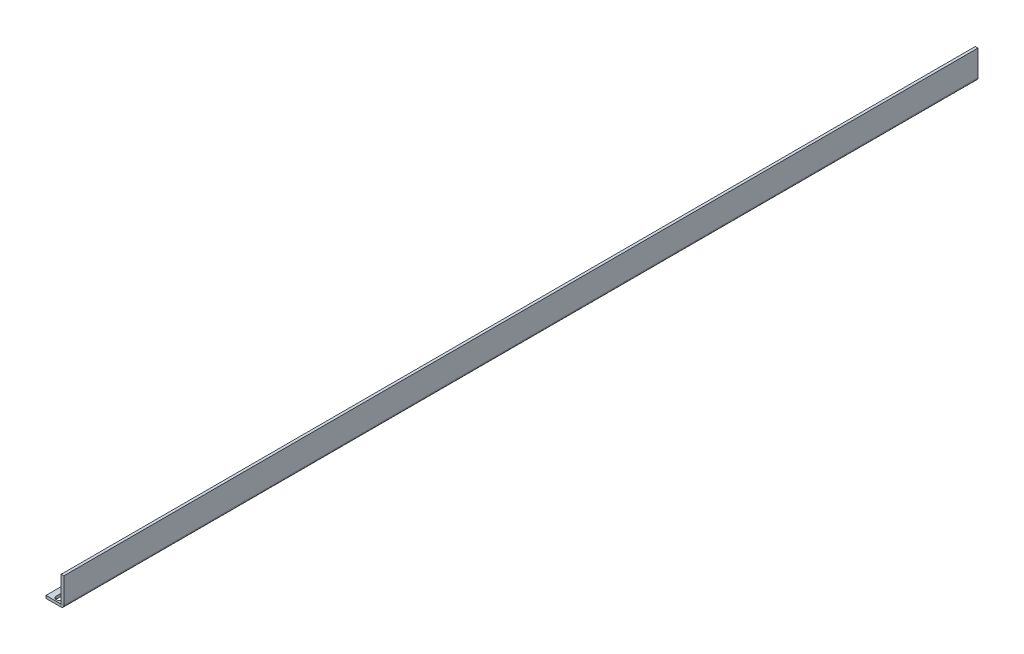
ISO-10303-21;
HEADER;
FILE_DESCRIPTION(('STEP AP214'),'2;1');
FILE_NAME('part.step','',(''),(''),'','','');
FILE_SCHEMA(('AUTOMOTIVE_DESIGN { 1 0 10303 214 1 1 1 1 }'));
ENDSEC;
DATA;
#1=APPLICATION_CONTEXT('core data for automotive mechanical design processes');
#2=APPLICATION_PROTOCOL_DEFINITION('international standard','automotive_design',2000,#1);
#3=PRODUCT_CONTEXT('',#1,'mechanical');
#4=PRODUCT('Part','Part','',(#3));
#5=PRODUCT_RELATED_PRODUCT_CATEGORY('part','',(#4));
#6=PRODUCT_DEFINITION_FORMATION('','',#4);
#7=PRODUCT_DEFINITION_CONTEXT('part definition',#1,'design');
#8=PRODUCT_DEFINITION('design','',#6,#7);
#9=PRODUCT_DEFINITION_SHAPE('','',#8);
#10=(LENGTH_UNIT() NAMED_UNIT(*) SI_UNIT(.MILLI.,.METRE.));
#11=(NAMED_UNIT(*) PLANE_ANGLE_UNIT() SI_UNIT($,.RADIAN.));
#12=(NAMED_UNIT(*) SI_UNIT($,.STERADIAN.) SOLID_ANGLE_UNIT());
#13=UNCERTAINTY_MEASURE_WITH_UNIT(LENGTH_MEASURE(1.E-05),#10,'distance_accuracy_value','');
#14=(GEOMETRIC_REPRESENTATION_CONTEXT(3) GLOBAL_UNCERTAINTY_ASSIGNED_CONTEXT((#13)) GLOBAL_UNIT_ASSIGNED_CONTEXT((#10,
#11,#12)) REPRESENTATION_CONTEXT('',''));
#15=CARTESIAN_POINT('',(0.,0.,0.));
#16=DIRECTION('',(0.,0.,1.));
#17=DIRECTION('',(1.,0.,0.));
#18=AXIS2_PLACEMENT_3D('',#15,#16,#17);
#19=CARTESIAN_POINT('',(1150.,-1240.,-755.));
#20=DIRECTION('',(0.,1.,0.));
#21=DIRECTION('',(-1.,0.,0.));
#22=AXIS2_PLACEMENT_3D('',#19,#20,#21);
#23=CYLINDRICAL_SURFACE('',#22,3.50000000000006);
#24=CARTESIAN_POINT('',(1150.,-1237.,-755.));
#25=DIRECTION('',(0.,1.,0.));
#26=DIRECTION('',(-1.,0.,0.));
#27=AXIS2_PLACEMENT_3D('',#24,#25,#26);
#28=CIRCLE('',#27,3.50000000000006);
#29=CARTESIAN_POINT('',(1153.5,-1237.,-755.));
#30=VERTEX_POINT('',#29);
#31=CARTESIAN_POINT('',(1146.5,-1237.,-755.));
#32=VERTEX_POINT('',#31);
#33=EDGE_CURVE('E360',#30,#32,#28,.F.);
#34=ORIENTED_EDGE('',*,*,#33,.F.);
#35=DIRECTION('',(0.,-1.,0.));
#36=VECTOR('',#35,1.);
#37=CARTESIAN_POINT('',(1153.5,-1240.,-755.));
#38=LINE('',#37,#36);
#39=CARTESIAN_POINT('',(1153.5,-1240.,-755.));
#40=VERTEX_POINT('',#39);
#41=EDGE_CURVE('E510',#30,#40,#38,.T.);
#42=ORIENTED_EDGE('',*,*,#41,.T.);
#43=CARTESIAN_POINT('',(1150.,-1240.,-755.));
#44=DIRECTION('',(0.,1.,0.));
#45=DIRECTION('',(-1.,0.,0.));
#46=AXIS2_PLACEMENT_3D('',#43,#44,#45);
#47=CIRCLE('',#46,3.50000000000006);
#48=CARTESIAN_POINT('',(1146.5,-1240.,-755.));
#49=VERTEX_POINT('',#48);
#50=EDGE_CURVE('E438',#40,#49,#47,.F.);
#51=ORIENTED_EDGE('',*,*,#50,.T.);
#52=DIRECTION('',(0.,-1.,0.));
#53=VECTOR('',#52,1.);
#54=CARTESIAN_POINT('',(1146.5,-1240.,-755.));
#55=LINE('',#54,#53);
#56=EDGE_CURVE('E504',#32,#49,#55,.T.);
#57=ORIENTED_EDGE('',*,*,#56,.F.);
#58=EDGE_LOOP('',(#34,#42,#51,#57));
#59=FACE_BOUND('',#58,.T.);
#60=ADVANCED_FACE('F42',(#59),#23,.F.);
#61=CARTESIAN_POINT('',(1153.5,-1240.,-776.8));
#62=DIRECTION('',(-1.,0.,0.));
#63=DIRECTION('',(0.,0.,1.));
#64=AXIS2_PLACEMENT_3D('',#61,#62,#63);
#65=PLANE('',#64);
#66=ORIENTED_EDGE('',*,*,#41,.F.);
#67=DIRECTION('',(0.,0.,1.));
#68=VECTOR('',#67,1.);
#69=CARTESIAN_POINT('',(1153.5,-1237.,-776.8));
#70=LINE('',#69,#68);
#71=CARTESIAN_POINT('',(1153.5,-1237.,-770.));
#72=VERTEX_POINT('',#71);
#73=EDGE_CURVE('E358',#72,#30,#70,.T.);
#74=ORIENTED_EDGE('',*,*,#73,.F.);
#75=DIRECTION('',(0.,-1.,0.));
#76=VECTOR('',#75,1.);
#77=CARTESIAN_POINT('',(1153.5,-1240.,-770.));
#78=LINE('',#77,#76);
#79=CARTESIAN_POINT('',(1153.5,-1240.,-770.));
#80=VERTEX_POINT('',#79);
#81=EDGE_CURVE('E507',#72,#80,#78,.T.);
#82=ORIENTED_EDGE('',*,*,#81,.T.);
#83=DIRECTION('',(0.,0.,1.));
#84=VECTOR('',#83,1.);
#85=CARTESIAN_POINT('',(1153.5,-1240.,-776.8));
#86=LINE('',#85,#84);
#87=EDGE_CURVE('E441',#80,#40,#86,.T.);
#88=ORIENTED_EDGE('',*,*,#87,.T.);
#89=EDGE_LOOP('',(#66,#74,#82,#88));
#90=FACE_BOUND('',#89,.T.);
#91=ADVANCED_FACE('F543',(#90),#65,.T.);
#92=CARTESIAN_POINT('',(1150.,-1240.,-770.));
#93=DIRECTION('',(0.,1.,0.));
#94=DIRECTION('',(-1.,0.,0.));
#95=AXIS2_PLACEMENT_3D('',#92,#93,#94);
#96=CYLINDRICAL_SURFACE('',#95,3.50000000000006);
#97=ORIENTED_EDGE('',*,*,#81,.F.);
#98=CARTESIAN_POINT('',(1150.,-1237.,-770.));
#99=DIRECTION('',(0.,1.,0.));
#100=DIRECTION('',(-1.,0.,0.));
#101=AXIS2_PLACEMENT_3D('',#98,#99,#100);
#102=CIRCLE('',#101,3.50000000000006);
#103=CARTESIAN_POINT('',(1146.5,-1237.,-770.));
#104=VERTEX_POINT('',#103);
#105=EDGE_CURVE('E356',#104,#72,#102,.F.);
#106=ORIENTED_EDGE('',*,*,#105,.F.);
#107=DIRECTION('',(0.,-1.,0.));
#108=VECTOR('',#107,1.);
#109=CARTESIAN_POINT('',(1146.5,-1240.,-770.));
#110=LINE('',#109,#108);
#111=CARTESIAN_POINT('',(1146.5,-1240.,-770.));
#112=VERTEX_POINT('',#111);
#113=EDGE_CURVE('E501',#104,#112,#110,.T.);
#114=ORIENTED_EDGE('',*,*,#113,.T.);
#115=CARTESIAN_POINT('',(1150.,-1240.,-770.));
#116=DIRECTION('',(0.,1.,0.));
#117=DIRECTION('',(-1.,0.,0.));
#118=AXIS2_PLACEMENT_3D('',#115,#116,#117);
#119=CIRCLE('',#118,3.50000000000006);
#120=EDGE_CURVE('E444',#112,#80,#119,.F.);
#121=ORIENTED_EDGE('',*,*,#120,.T.);
#122=EDGE_LOOP('',(#97,#106,#114,#121));
#123=FACE_BOUND('',#122,.T.);
#124=ADVANCED_FACE('F549',(#123),#96,.F.);
#125=CARTESIAN_POINT('',(1146.5,-1240.,-776.8));
#126=DIRECTION('',(-1.,0.,0.));
#127=DIRECTION('',(0.,0.,1.));
#128=AXIS2_PLACEMENT_3D('',#125,#126,#127);
#129=PLANE('',#128);
#130=ORIENTED_EDGE('',*,*,#113,.F.);
#131=DIRECTION('',(0.,0.,1.));
#132=VECTOR('',#131,1.);
#133=CARTESIAN_POINT('',(1146.5,-1237.,-776.8));
#134=LINE('',#133,#132);
#135=EDGE_CURVE('E354',#32,#104,#134,.F.);
#136=ORIENTED_EDGE('',*,*,#135,.F.);
#137=ORIENTED_EDGE('',*,*,#56,.T.);
#138=DIRECTION('',(0.,0.,1.));
#139=VECTOR('',#138,1.);
#140=CARTESIAN_POINT('',(1146.5,-1240.,-776.8));
#141=LINE('',#140,#139);
#142=EDGE_CURVE('E436',#49,#112,#141,.F.);
#143=ORIENTED_EDGE('',*,*,#142,.T.);
#144=EDGE_LOOP('',(#130,#136,#137,#143));
#145=FACE_BOUND('',#144,.T.);
#146=ADVANCED_FACE('F638',(#145),#129,.F.);
#147=CARTESIAN_POINT('',(1150.,-1240.,-555.));
#148=DIRECTION('',(0.,1.,0.));
#149=DIRECTION('',(-1.,0.,0.));
#150=AXIS2_PLACEMENT_3D('',#147,#148,#149);
#151=CYLINDRICAL_SURFACE('',#150,3.50000000000006);
#152=CARTESIAN_POINT('',(1150.,-1237.,-555.));
#153=DIRECTION('',(0.,1.,0.));
#154=DIRECTION('',(-1.,0.,0.));
#155=AXIS2_PLACEMENT_3D('',#152,#153,#154);
#156=CIRCLE('',#155,3.50000000000006);
#157=CARTESIAN_POINT('',(1153.5,-1237.,-555.));
#158=VERTEX_POINT('',#157);
#159=CARTESIAN_POINT('',(1146.5,-1237.,-555.));
#160=VERTEX_POINT('',#159);
#161=EDGE_CURVE('E351',#158,#160,#156,.F.);
#162=ORIENTED_EDGE('',*,*,#161,.F.);
#163=DIRECTION('',(0.,-1.,0.));
#164=VECTOR('',#163,1.);
#165=CARTESIAN_POINT('',(1153.5,-1240.,-555.));
#166=LINE('',#165,#164);
#167=CARTESIAN_POINT('',(1153.5,-1240.,-555.));
#168=VERTEX_POINT('',#167);
#169=EDGE_CURVE('E498',#158,#168,#166,.T.);
#170=ORIENTED_EDGE('',*,*,#169,.T.);
#171=CARTESIAN_POINT('',(1150.,-1240.,-555.));
#172=DIRECTION('',(0.,1.,0.));
#173=DIRECTION('',(-1.,0.,0.));
#174=AXIS2_PLACEMENT_3D('',#171,#172,#173);
#175=CIRCLE('',#174,3.50000000000006);
#176=CARTESIAN_POINT('',(1146.5,-1240.,-555.));
#177=VERTEX_POINT('',#176);
#178=EDGE_CURVE('E427',#168,#177,#175,.F.);
#179=ORIENTED_EDGE('',*,*,#178,.T.);
#180=DIRECTION('',(0.,-1.,0.));
#181=VECTOR('',#180,1.);
#182=CARTESIAN_POINT('',(1146.5,-1240.,-555.));
#183=LINE('',#182,#181);
#184=EDGE_CURVE('E492',#160,#177,#183,.T.);
#185=ORIENTED_EDGE('',*,*,#184,.F.);
#186=EDGE_LOOP('',(#162,#170,#179,#185));
#187=FACE_BOUND('',#186,.T.);
#188=ADVANCED_FACE('F643',(#187),#151,.F.);
#189=CARTESIAN_POINT('',(1153.5,-1240.,-776.8));
#190=DIRECTION('',(-1.,0.,0.));
#191=DIRECTION('',(0.,0.,1.));
#192=AXIS2_PLACEMENT_3D('',#189,#190,#191);
#193=PLANE('',#192);
#194=ORIENTED_EDGE('',*,*,#169,.F.);
#195=DIRECTION('',(0.,0.,1.));
#196=VECTOR('',#195,1.);
#197=CARTESIAN_POINT('',(1153.5,-1237.,-776.8));
#198=LINE('',#197,#196);
#199=CARTESIAN_POINT('',(1153.5,-1237.,-570.));
#200=VERTEX_POINT('',#199);
#201=EDGE_CURVE('E349',#200,#158,#198,.T.);
#202=ORIENTED_EDGE('',*,*,#201,.F.);
#203=DIRECTION('',(0.,-1.,0.));
#204=VECTOR('',#203,1.);
#205=CARTESIAN_POINT('',(1153.5,-1240.,-570.));
#206=LINE('',#205,#204);
#207=CARTESIAN_POINT('',(1153.5,-1240.,-570.));
#208=VERTEX_POINT('',#207);
#209=EDGE_CURVE('E495',#200,#208,#206,.T.);
#210=ORIENTED_EDGE('',*,*,#209,.T.);
#211=DIRECTION('',(0.,0.,1.));
#212=VECTOR('',#211,1.);
#213=CARTESIAN_POINT('',(1153.5,-1240.,-776.8));
#214=LINE('',#213,#212);
#215=EDGE_CURVE('E430',#208,#168,#214,.T.);
#216=ORIENTED_EDGE('',*,*,#215,.T.);
#217=EDGE_LOOP('',(#194,#202,#210,#216));
#218=FACE_BOUND('',#217,.T.);
#219=ADVANCED_FACE('F649',(#218),#193,.T.);
#220=CARTESIAN_POINT('',(1150.,-1240.,-570.));
#221=DIRECTION('',(0.,1.,0.));
#222=DIRECTION('',(-1.,0.,0.));
#223=AXIS2_PLACEMENT_3D('',#220,#221,#222);
#224=CYLINDRICAL_SURFACE('',#223,3.50000000000006);
#225=ORIENTED_EDGE('',*,*,#209,.F.);
#226=CARTESIAN_POINT('',(1150.,-1237.,-570.));
#227=DIRECTION('',(0.,1.,0.));
#228=DIRECTION('',(-1.,0.,0.));
#229=AXIS2_PLACEMENT_3D('',#226,#227,#228);
#230=CIRCLE('',#229,3.50000000000006);
#231=CARTESIAN_POINT('',(1146.5,-1237.,-570.));
#232=VERTEX_POINT('',#231);
#233=EDGE_CURVE('E347',#232,#200,#230,.F.);
#234=ORIENTED_EDGE('',*,*,#233,.F.);
#235=DIRECTION('',(0.,-1.,0.));
#236=VECTOR('',#235,1.);
#237=CARTESIAN_POINT('',(1146.5,-1240.,-570.));
#238=LINE('',#237,#236);
#239=CARTESIAN_POINT('',(1146.5,-1240.,-570.));
#240=VERTEX_POINT('',#239);
#241=EDGE_CURVE('E489',#232,#240,#238,.T.);
#242=ORIENTED_EDGE('',*,*,#241,.T.);
#243=CARTESIAN_POINT('',(1150.,-1240.,-570.));
#244=DIRECTION('',(0.,1.,0.));
#245=DIRECTION('',(-1.,0.,0.));
#246=AXIS2_PLACEMENT_3D('',#243,#244,#245);
#247=CIRCLE('',#246,3.50000000000006);
#248=EDGE_CURVE('E433',#240,#208,#247,.F.);
#249=ORIENTED_EDGE('',*,*,#248,.T.);
#250=EDGE_LOOP('',(#225,#234,#242,#249));
#251=FACE_BOUND('',#250,.T.);
#252=ADVANCED_FACE('F655',(#251),#224,.F.);
#253=CARTESIAN_POINT('',(1146.5,-1240.,-776.8));
#254=DIRECTION('',(-1.,0.,0.));
#255=DIRECTION('',(0.,0.,1.));
#256=AXIS2_PLACEMENT_3D('',#253,#254,#255);
#257=PLANE('',#256);
#258=ORIENTED_EDGE('',*,*,#241,.F.);
#259=DIRECTION('',(0.,0.,1.));
#260=VECTOR('',#259,1.);
#261=CARTESIAN_POINT('',(1146.5,-1237.,-776.8));
#262=LINE('',#261,#260);
#263=EDGE_CURVE('E345',#160,#232,#262,.F.);
#264=ORIENTED_EDGE('',*,*,#263,.F.);
#265=ORIENTED_EDGE('',*,*,#184,.T.);
#266=DIRECTION('',(0.,0.,1.));
#267=VECTOR('',#266,1.);
#268=CARTESIAN_POINT('',(1146.5,-1240.,-776.8));
#269=LINE('',#268,#267);
#270=EDGE_CURVE('E425',#177,#240,#269,.F.);
#271=ORIENTED_EDGE('',*,*,#270,.T.);
#272=EDGE_LOOP('',(#258,#264,#265,#271));
#273=FACE_BOUND('',#272,.T.);
#274=ADVANCED_FACE('F659',(#273),#257,.F.);
#275=CARTESIAN_POINT('',(1150.,-1240.,-355.));
#276=DIRECTION('',(0.,1.,0.));
#277=DIRECTION('',(-1.,0.,0.));
#278=AXIS2_PLACEMENT_3D('',#275,#276,#277);
#279=CYLINDRICAL_SURFACE('',#278,3.50000000000006);
#280=CARTESIAN_POINT('',(1150.,-1237.,-355.));
#281=DIRECTION('',(0.,1.,0.));
#282=DIRECTION('',(-1.,0.,0.));
#283=AXIS2_PLACEMENT_3D('',#280,#281,#282);
#284=CIRCLE('',#283,3.50000000000006);
#285=CARTESIAN_POINT('',(1153.5,-1237.,-355.));
#286=VERTEX_POINT('',#285);
#287=CARTESIAN_POINT('',(1146.5,-1237.,-355.));
#288=VERTEX_POINT('',#287);
#289=EDGE_CURVE('E342',#286,#288,#284,.F.);
#290=ORIENTED_EDGE('',*,*,#289,.F.);
#291=DIRECTION('',(0.,-1.,0.));
#292=VECTOR('',#291,1.);
#293=CARTESIAN_POINT('',(1153.5,-1240.,-355.));
#294=LINE('',#293,#292);
#295=CARTESIAN_POINT('',(1153.5,-1240.,-355.));
#296=VERTEX_POINT('',#295);
#297=EDGE_CURVE('E486',#286,#296,#294,.T.);
#298=ORIENTED_EDGE('',*,*,#297,.T.);
#299=CARTESIAN_POINT('',(1150.,-1240.,-355.));
#300=DIRECTION('',(0.,1.,0.));
#301=DIRECTION('',(-1.,0.,0.));
#302=AXIS2_PLACEMENT_3D('',#299,#300,#301);
#303=CIRCLE('',#302,3.50000000000006);
#304=CARTESIAN_POINT('',(1146.5,-1240.,-355.));
#305=VERTEX_POINT('',#304);
#306=EDGE_CURVE('E416',#296,#305,#303,.F.);
#307=ORIENTED_EDGE('',*,*,#306,.T.);
#308=DIRECTION('',(0.,-1.,0.));
#309=VECTOR('',#308,1.);
#310=CARTESIAN_POINT('',(1146.5,-1240.,-355.));
#311=LINE('',#310,#309);
#312=EDGE_CURVE('E480',#288,#305,#311,.T.);
#313=ORIENTED_EDGE('',*,*,#312,.F.);
#314=EDGE_LOOP('',(#290,#298,#307,#313));
#315=FACE_BOUND('',#314,.T.);
#316=ADVANCED_FACE('F663',(#315),#279,.F.);
#317=CARTESIAN_POINT('',(1153.5,-1240.,-776.8));
#318=DIRECTION('',(-1.,0.,0.));
#319=DIRECTION('',(0.,0.,1.));
#320=AXIS2_PLACEMENT_3D('',#317,#318,#319);
#321=PLANE('',#320);
#322=ORIENTED_EDGE('',*,*,#297,.F.);
#323=DIRECTION('',(0.,0.,1.));
#324=VECTOR('',#323,1.);
#325=CARTESIAN_POINT('',(1153.5,-1237.,-776.8));
#326=LINE('',#325,#324);
#327=CARTESIAN_POINT('',(1153.5,-1237.,-370.));
#328=VERTEX_POINT('',#327);
#329=EDGE_CURVE('E340',#328,#286,#326,.T.);
#330=ORIENTED_EDGE('',*,*,#329,.F.);
#331=DIRECTION('',(0.,-1.,0.));
#332=VECTOR('',#331,1.);
#333=CARTESIAN_POINT('',(1153.5,-1240.,-370.));
#334=LINE('',#333,#332);
#335=CARTESIAN_POINT('',(1153.5,-1240.,-370.));
#336=VERTEX_POINT('',#335);
#337=EDGE_CURVE('E483',#328,#336,#334,.T.);
#338=ORIENTED_EDGE('',*,*,#337,.T.);
#339=DIRECTION('',(0.,0.,1.));
#340=VECTOR('',#339,1.);
#341=CARTESIAN_POINT('',(1153.5,-1240.,-776.8));
#342=LINE('',#341,#340);
#343=EDGE_CURVE('E419',#336,#296,#342,.T.);
#344=ORIENTED_EDGE('',*,*,#343,.T.);
#345=EDGE_LOOP('',(#322,#330,#338,#344));
#346=FACE_BOUND('',#345,.T.);
#347=ADVANCED_FACE('F667',(#346),#321,.T.);
#348=CARTESIAN_POINT('',(1150.,-1240.,-370.));
#349=DIRECTION('',(0.,1.,0.));
#350=DIRECTION('',(-1.,0.,0.));
#351=AXIS2_PLACEMENT_3D('',#348,#349,#350);
#352=CYLINDRICAL_SURFACE('',#351,3.50000000000006);
#353=ORIENTED_EDGE('',*,*,#337,.F.);
#354=CARTESIAN_POINT('',(1150.,-1237.,-370.));
#355=DIRECTION('',(0.,1.,0.));
#356=DIRECTION('',(-1.,0.,0.));
#357=AXIS2_PLACEMENT_3D('',#354,#355,#356);
#358=CIRCLE('',#357,3.50000000000006);
#359=CARTESIAN_POINT('',(1146.5,-1237.,-370.));
#360=VERTEX_POINT('',#359);
#361=EDGE_CURVE('E338',#360,#328,#358,.F.);
#362=ORIENTED_EDGE('',*,*,#361,.F.);
#363=DIRECTION('',(0.,-1.,0.));
#364=VECTOR('',#363,1.);
#365=CARTESIAN_POINT('',(1146.5,-1240.,-370.));
#366=LINE('',#365,#364);
#367=CARTESIAN_POINT('',(1146.5,-1240.,-370.));
#368=VERTEX_POINT('',#367);
#369=EDGE_CURVE('E477',#360,#368,#366,.T.);
#370=ORIENTED_EDGE('',*,*,#369,.T.);
#371=CARTESIAN_POINT('',(1150.,-1240.,-370.));
#372=DIRECTION('',(0.,1.,0.));
#373=DIRECTION('',(-1.,0.,0.));
#374=AXIS2_PLACEMENT_3D('',#371,#372,#373);
#375=CIRCLE('',#374,3.50000000000006);
#376=EDGE_CURVE('E422',#368,#336,#375,.F.);
#377=ORIENTED_EDGE('',*,*,#376,.T.);
#378=EDGE_LOOP('',(#353,#362,#370,#377));
#379=FACE_BOUND('',#378,.T.);
#380=ADVANCED_FACE('F671',(#379),#352,.F.);
#381=CARTESIAN_POINT('',(1146.5,-1240.,-776.8));
#382=DIRECTION('',(-1.,0.,0.));
#383=DIRECTION('',(0.,0.,1.));
#384=AXIS2_PLACEMENT_3D('',#381,#382,#383);
#385=PLANE('',#384);
#386=ORIENTED_EDGE('',*,*,#369,.F.);
#387=DIRECTION('',(0.,0.,1.));
#388=VECTOR('',#387,1.);
#389=CARTESIAN_POINT('',(1146.5,-1237.,-776.8));
#390=LINE('',#389,#388);
#391=EDGE_CURVE('E336',#288,#360,#390,.F.);
#392=ORIENTED_EDGE('',*,*,#391,.F.);
#393=ORIENTED_EDGE('',*,*,#312,.T.);
#394=DIRECTION('',(0.,0.,1.));
#395=VECTOR('',#394,1.);
#396=CARTESIAN_POINT('',(1146.5,-1240.,-776.8));
#397=LINE('',#396,#395);
#398=EDGE_CURVE('E414',#305,#368,#397,.F.);
#399=ORIENTED_EDGE('',*,*,#398,.T.);
#400=EDGE_LOOP('',(#386,#392,#393,#399));
#401=FACE_BOUND('',#400,.T.);
#402=ADVANCED_FACE('F675',(#401),#385,.F.);
#403=CARTESIAN_POINT('',(1150.,-1240.,-155.));
#404=DIRECTION('',(0.,1.,0.));
#405=DIRECTION('',(-1.,0.,0.));
#406=AXIS2_PLACEMENT_3D('',#403,#404,#405);
#407=CYLINDRICAL_SURFACE('',#406,3.50000000000006);
#408=CARTESIAN_POINT('',(1150.,-1237.,-155.));
#409=DIRECTION('',(0.,1.,0.));
#410=DIRECTION('',(-1.,0.,0.));
#411=AXIS2_PLACEMENT_3D('',#408,#409,#410);
#412=CIRCLE('',#411,3.50000000000006);
#413=CARTESIAN_POINT('',(1153.5,-1237.,-155.));
#414=VERTEX_POINT('',#413);
#415=CARTESIAN_POINT('',(1146.5,-1237.,-155.));
#416=VERTEX_POINT('',#415);
#417=EDGE_CURVE('E333',#414,#416,#412,.F.);
#418=ORIENTED_EDGE('',*,*,#417,.F.);
#419=DIRECTION('',(0.,-1.,0.));
#420=VECTOR('',#419,1.);
#421=CARTESIAN_POINT('',(1153.5,-1240.,-155.));
#422=LINE('',#421,#420);
#423=CARTESIAN_POINT('',(1153.5,-1240.,-155.));
#424=VERTEX_POINT('',#423);
#425=EDGE_CURVE('E474',#414,#424,#422,.T.);
#426=ORIENTED_EDGE('',*,*,#425,.T.);
#427=CARTESIAN_POINT('',(1150.,-1240.,-155.));
#428=DIRECTION('',(0.,1.,0.));
#429=DIRECTION('',(-1.,0.,0.));
#430=AXIS2_PLACEMENT_3D('',#427,#428,#429);
#431=CIRCLE('',#430,3.50000000000006);
#432=CARTESIAN_POINT('',(1146.5,-1240.,-155.));
#433=VERTEX_POINT('',#432);
#434=EDGE_CURVE('E405',#424,#433,#431,.F.);
#435=ORIENTED_EDGE('',*,*,#434,.T.);
#436=DIRECTION('',(0.,-1.,0.));
#437=VECTOR('',#436,1.);
#438=CARTESIAN_POINT('',(1146.5,-1240.,-155.));
#439=LINE('',#438,#437);
#440=EDGE_CURVE('E468',#416,#433,#439,.T.);
#441=ORIENTED_EDGE('',*,*,#440,.F.);
#442=EDGE_LOOP('',(#418,#426,#435,#441));
#443=FACE_BOUND('',#442,.T.);
#444=ADVANCED_FACE('F679',(#443),#407,.F.);
#445=CARTESIAN_POINT('',(1153.5,-1240.,-776.8));
#446=DIRECTION('',(-1.,0.,0.));
#447=DIRECTION('',(0.,0.,1.));
#448=AXIS2_PLACEMENT_3D('',#445,#446,#447);
#449=PLANE('',#448);
#450=ORIENTED_EDGE('',*,*,#425,.F.);
#451=DIRECTION('',(0.,0.,1.));
#452=VECTOR('',#451,1.);
#453=CARTESIAN_POINT('',(1153.5,-1237.,-776.8));
#454=LINE('',#453,#452);
#455=CARTESIAN_POINT('',(1153.5,-1237.,-170.));
#456=VERTEX_POINT('',#455);
#457=EDGE_CURVE('E331',#456,#414,#454,.T.);
#458=ORIENTED_EDGE('',*,*,#457,.F.);
#459=DIRECTION('',(0.,-1.,0.));
#460=VECTOR('',#459,1.);
#461=CARTESIAN_POINT('',(1153.5,-1240.,-170.));
#462=LINE('',#461,#460);
#463=CARTESIAN_POINT('',(1153.5,-1240.,-170.));
#464=VERTEX_POINT('',#463);
#465=EDGE_CURVE('E471',#456,#464,#462,.T.);
#466=ORIENTED_EDGE('',*,*,#465,.T.);
#467=DIRECTION('',(0.,0.,1.));
#468=VECTOR('',#467,1.);
#469=CARTESIAN_POINT('',(1153.5,-1240.,-776.8));
#470=LINE('',#469,#468);
#471=EDGE_CURVE('E408',#464,#424,#470,.T.);
#472=ORIENTED_EDGE('',*,*,#471,.T.);
#473=EDGE_LOOP('',(#450,#458,#466,#472));
#474=FACE_BOUND('',#473,.T.);
#475=ADVANCED_FACE('F683',(#474),#449,.T.);
#476=CARTESIAN_POINT('',(1150.,-1240.,-170.));
#477=DIRECTION('',(0.,1.,0.));
#478=DIRECTION('',(-1.,0.,0.));
#479=AXIS2_PLACEMENT_3D('',#476,#477,#478);
#480=CYLINDRICAL_SURFACE('',#479,3.50000000000006);
#481=ORIENTED_EDGE('',*,*,#465,.F.);
#482=CARTESIAN_POINT('',(1150.,-1237.,-170.));
#483=DIRECTION('',(0.,1.,0.));
#484=DIRECTION('',(-1.,0.,0.));
#485=AXIS2_PLACEMENT_3D('',#482,#483,#484);
#486=CIRCLE('',#485,3.50000000000006);
#487=CARTESIAN_POINT('',(1146.5,-1237.,-170.));
#488=VERTEX_POINT('',#487);
#489=EDGE_CURVE('E329',#488,#456,#486,.F.);
#490=ORIENTED_EDGE('',*,*,#489,.F.);
#491=DIRECTION('',(0.,-1.,0.));
#492=VECTOR('',#491,1.);
#493=CARTESIAN_POINT('',(1146.5,-1240.,-170.));
#494=LINE('',#493,#492);
#495=CARTESIAN_POINT('',(1146.5,-1240.,-170.));
#496=VERTEX_POINT('',#495);
#497=EDGE_CURVE('E465',#488,#496,#494,.T.);
#498=ORIENTED_EDGE('',*,*,#497,.T.);
#499=CARTESIAN_POINT('',(1150.,-1240.,-170.));
#500=DIRECTION('',(0.,1.,0.));
#501=DIRECTION('',(-1.,0.,0.));
#502=AXIS2_PLACEMENT_3D('',#499,#500,#501);
#503=CIRCLE('',#502,3.50000000000006);
#504=EDGE_CURVE('E411',#496,#464,#503,.F.);
#505=ORIENTED_EDGE('',*,*,#504,.T.);
#506=EDGE_LOOP('',(#481,#490,#498,#505));
#507=FACE_BOUND('',#506,.T.);
#508=ADVANCED_FACE('F687',(#507),#480,.F.);
#509=CARTESIAN_POINT('',(1146.5,-1240.,-776.8));
#510=DIRECTION('',(-1.,0.,0.));
#511=DIRECTION('',(0.,0.,1.));
#512=AXIS2_PLACEMENT_3D('',#509,#510,#511);
#513=PLANE('',#512);
#514=ORIENTED_EDGE('',*,*,#497,.F.);
#515=DIRECTION('',(0.,0.,1.));
#516=VECTOR('',#515,1.);
#517=CARTESIAN_POINT('',(1146.5,-1237.,-776.8));
#518=LINE('',#517,#516);
#519=EDGE_CURVE('E327',#416,#488,#518,.F.);
#520=ORIENTED_EDGE('',*,*,#519,.F.);
#521=ORIENTED_EDGE('',*,*,#440,.T.);
#522=DIRECTION('',(0.,0.,1.));
#523=VECTOR('',#522,1.);
#524=CARTESIAN_POINT('',(1146.5,-1240.,-776.8));
#525=LINE('',#524,#523);
#526=EDGE_CURVE('E403',#433,#496,#525,.F.);
#527=ORIENTED_EDGE('',*,*,#526,.T.);
#528=EDGE_LOOP('',(#514,#520,#521,#527));
#529=FACE_BOUND('',#528,.T.);
#530=ADVANCED_FACE('F691',(#529),#513,.F.);
#531=CARTESIAN_POINT('',(1150.,-1240.,44.9999999999997));
#532=DIRECTION('',(0.,1.,0.));
#533=DIRECTION('',(-1.,0.,0.));
#534=AXIS2_PLACEMENT_3D('',#531,#532,#533);
#535=CYLINDRICAL_SURFACE('',#534,3.50000000000006);
#536=CARTESIAN_POINT('',(1150.,-1237.,44.9999999999997));
#537=DIRECTION('',(0.,1.,0.));
#538=DIRECTION('',(-1.,0.,0.));
#539=AXIS2_PLACEMENT_3D('',#536,#537,#538);
#540=CIRCLE('',#539,3.50000000000006);
#541=CARTESIAN_POINT('',(1153.5,-1237.,44.9999999999997));
#542=VERTEX_POINT('',#541);
#543=CARTESIAN_POINT('',(1146.5,-1237.,44.9999999999997));
#544=VERTEX_POINT('',#543);
#545=EDGE_CURVE('E324',#542,#544,#540,.F.);
#546=ORIENTED_EDGE('',*,*,#545,.F.);
#547=DIRECTION('',(0.,-1.,0.));
#548=VECTOR('',#547,1.);
#549=CARTESIAN_POINT('',(1153.5,-1240.,44.9999999999997));
#550=LINE('',#549,#548);
#551=CARTESIAN_POINT('',(1153.5,-1240.,44.9999999999997));
#552=VERTEX_POINT('',#551);
#553=EDGE_CURVE('E462',#542,#552,#550,.T.);
#554=ORIENTED_EDGE('',*,*,#553,.T.);
#555=CARTESIAN_POINT('',(1150.,-1240.,44.9999999999997));
#556=DIRECTION('',(0.,1.,0.));
#557=DIRECTION('',(-1.,0.,0.));
#558=AXIS2_PLACEMENT_3D('',#555,#556,#557);
#559=CIRCLE('',#558,3.50000000000006);
#560=CARTESIAN_POINT('',(1146.5,-1240.,44.9999999999997));
#561=VERTEX_POINT('',#560);
#562=EDGE_CURVE('E394',#552,#561,#559,.F.);
#563=ORIENTED_EDGE('',*,*,#562,.T.);
#564=DIRECTION('',(0.,-1.,0.));
#565=VECTOR('',#564,1.);
#566=CARTESIAN_POINT('',(1146.5,-1240.,44.9999999999997));
#567=LINE('',#566,#565);
#568=EDGE_CURVE('E456',#544,#561,#567,.T.);
#569=ORIENTED_EDGE('',*,*,#568,.F.);
#570=EDGE_LOOP('',(#546,#554,#563,#569));
#571=FACE_BOUND('',#570,.T.);
#572=ADVANCED_FACE('F695',(#571),#535,.F.);
#573=CARTESIAN_POINT('',(1153.5,-1240.,-776.8));
#574=DIRECTION('',(-1.,0.,0.));
#575=DIRECTION('',(0.,0.,1.));
#576=AXIS2_PLACEMENT_3D('',#573,#574,#575);
#577=PLANE('',#576);
#578=ORIENTED_EDGE('',*,*,#553,.F.);
#579=DIRECTION('',(0.,0.,1.));
#580=VECTOR('',#579,1.);
#581=CARTESIAN_POINT('',(1153.5,-1237.,-776.8));
#582=LINE('',#581,#580);
#583=CARTESIAN_POINT('',(1153.5,-1237.,29.9999999999997));
#584=VERTEX_POINT('',#583);
#585=EDGE_CURVE('E322',#584,#542,#582,.T.);
#586=ORIENTED_EDGE('',*,*,#585,.F.);
#587=DIRECTION('',(0.,-1.,0.));
#588=VECTOR('',#587,1.);
#589=CARTESIAN_POINT('',(1153.5,-1240.,29.9999999999997));
#590=LINE('',#589,#588);
#591=CARTESIAN_POINT('',(1153.5,-1240.,29.9999999999997));
#592=VERTEX_POINT('',#591);
#593=EDGE_CURVE('E459',#584,#592,#590,.T.);
#594=ORIENTED_EDGE('',*,*,#593,.T.);
#595=DIRECTION('',(0.,0.,1.));
#596=VECTOR('',#595,1.);
#597=CARTESIAN_POINT('',(1153.5,-1240.,-776.8));
#598=LINE('',#597,#596);
#599=EDGE_CURVE('E397',#592,#552,#598,.T.);
#600=ORIENTED_EDGE('',*,*,#599,.T.);
#601=EDGE_LOOP('',(#578,#586,#594,#600));
#602=FACE_BOUND('',#601,.T.);
#603=ADVANCED_FACE('F699',(#602),#577,.T.);
#604=CARTESIAN_POINT('',(1150.,-1240.,29.9999999999997));
#605=DIRECTION('',(0.,1.,0.));
#606=DIRECTION('',(-1.,0.,0.));
#607=AXIS2_PLACEMENT_3D('',#604,#605,#606);
#608=CYLINDRICAL_SURFACE('',#607,3.50000000000006);
#609=ORIENTED_EDGE('',*,*,#593,.F.);
#610=CARTESIAN_POINT('',(1150.,-1237.,29.9999999999997));
#611=DIRECTION('',(0.,1.,0.));
#612=DIRECTION('',(-1.,0.,0.));
#613=AXIS2_PLACEMENT_3D('',#610,#611,#612);
#614=CIRCLE('',#613,3.50000000000006);
#615=CARTESIAN_POINT('',(1146.5,-1237.,29.9999999999997));
#616=VERTEX_POINT('',#615);
#617=EDGE_CURVE('E320',#616,#584,#614,.F.);
#618=ORIENTED_EDGE('',*,*,#617,.F.);
#619=DIRECTION('',(0.,-1.,0.));
#620=VECTOR('',#619,1.);
#621=CARTESIAN_POINT('',(1146.5,-1240.,29.9999999999997));
#622=LINE('',#621,#620);
#623=CARTESIAN_POINT('',(1146.5,-1240.,29.9999999999997));
#624=VERTEX_POINT('',#623);
#625=EDGE_CURVE('E453',#616,#624,#622,.T.);
#626=ORIENTED_EDGE('',*,*,#625,.T.);
#627=CARTESIAN_POINT('',(1150.,-1240.,29.9999999999997));
#628=DIRECTION('',(0.,1.,0.));
#629=DIRECTION('',(-1.,0.,0.));
#630=AXIS2_PLACEMENT_3D('',#627,#628,#629);
#631=CIRCLE('',#630,3.50000000000006);
#632=EDGE_CURVE('E400',#624,#592,#631,.F.);
#633=ORIENTED_EDGE('',*,*,#632,.T.);
#634=EDGE_LOOP('',(#609,#618,#626,#633));
#635=FACE_BOUND('',#634,.T.);
#636=ADVANCED_FACE('F537',(#635),#608,.F.);
#637=CARTESIAN_POINT('',(1146.5,-1240.,-776.8));
#638=DIRECTION('',(-1.,0.,0.));
#639=DIRECTION('',(0.,0.,1.));
#640=AXIS2_PLACEMENT_3D('',#637,#638,#639);
#641=PLANE('',#640);
#642=ORIENTED_EDGE('',*,*,#625,.F.);
#643=DIRECTION('',(0.,0.,1.));
#644=VECTOR('',#643,1.);
#645=CARTESIAN_POINT('',(1146.5,-1237.,-776.8));
#646=LINE('',#645,#644);
#647=EDGE_CURVE('E318',#544,#616,#646,.F.);
#648=ORIENTED_EDGE('',*,*,#647,.F.);
#649=ORIENTED_EDGE('',*,*,#568,.T.);
#650=DIRECTION('',(0.,0.,1.));
#651=VECTOR('',#650,1.);
#652=CARTESIAN_POINT('',(1146.5,-1240.,-776.8));
#653=LINE('',#652,#651);
#654=EDGE_CURVE('E392',#561,#624,#653,.F.);
#655=ORIENTED_EDGE('',*,*,#654,.T.);
#656=EDGE_LOOP('',(#642,#648,#649,#655));
#657=FACE_BOUND('',#656,.T.);
#658=ADVANCED_FACE('F527',(#657),#641,.F.);
#659=CARTESIAN_POINT('',(1160.,-1240.,-776.8));
#660=DIRECTION('',(0.,1.,0.));
#661=DIRECTION('',(-1.,0.,0.));
#662=AXIS2_PLACEMENT_3D('',#659,#660,#661);
#663=PLANE('',#662);
#664=DIRECTION('',(0.,0.,1.));
#665=VECTOR('',#664,1.);
#666=CARTESIAN_POINT('',(1146.5,-1240.,-776.8));
#667=LINE('',#666,#665);
#668=CARTESIAN_POINT('',(1146.5,-1240.,245.));
#669=VERTEX_POINT('',#668);
#670=CARTESIAN_POINT('',(1146.5,-1240.,230.));
#671=VERTEX_POINT('',#670);
#672=EDGE_CURVE('E376',#669,#671,#667,.F.);
#673=ORIENTED_EDGE('',*,*,#672,.F.);
#674=CARTESIAN_POINT('',(1150.,-1240.,245.));
#675=DIRECTION('',(0.,1.,0.));
#676=DIRECTION('',(-1.,0.,0.));
#677=AXIS2_PLACEMENT_3D('',#674,#675,#676);
#678=CIRCLE('',#677,3.50000000000006);
#679=CARTESIAN_POINT('',(1153.5,-1240.,245.));
#680=VERTEX_POINT('',#679);
#681=EDGE_CURVE('E389',#680,#669,#678,.F.);
#682=ORIENTED_EDGE('',*,*,#681,.F.);
#683=DIRECTION('',(0.,0.,1.));
#684=VECTOR('',#683,1.);
#685=CARTESIAN_POINT('',(1153.5,-1240.,-776.8));
#686=LINE('',#685,#684);
#687=CARTESIAN_POINT('',(1153.5,-1240.,230.));
#688=VERTEX_POINT('',#687);
#689=EDGE_CURVE('E386',#688,#680,#686,.T.);
#690=ORIENTED_EDGE('',*,*,#689,.F.);
#691=CARTESIAN_POINT('',(1150.,-1240.,230.));
#692=DIRECTION('',(0.,1.,0.));
#693=DIRECTION('',(-1.,0.,0.));
#694=AXIS2_PLACEMENT_3D('',#691,#692,#693);
#695=CIRCLE('',#694,3.50000000000006);
#696=EDGE_CURVE('E381',#671,#688,#695,.F.);
#697=ORIENTED_EDGE('',*,*,#696,.F.);
#698=EDGE_LOOP('',(#673,#682,#690,#697));
#699=FACE_BOUND('',#698,.T.);
#700=ORIENTED_EDGE('',*,*,#654,.F.);
#701=ORIENTED_EDGE('',*,*,#562,.F.);
#702=ORIENTED_EDGE('',*,*,#599,.F.);
#703=ORIENTED_EDGE('',*,*,#632,.F.);
#704=EDGE_LOOP('',(#700,#701,#702,#703));
#705=FACE_BOUND('',#704,.T.);
#706=ORIENTED_EDGE('',*,*,#526,.F.);
#707=ORIENTED_EDGE('',*,*,#434,.F.);
#708=ORIENTED_EDGE('',*,*,#471,.F.);
#709=ORIENTED_EDGE('',*,*,#504,.F.);
#710=EDGE_LOOP('',(#706,#707,#708,#709));
#711=FACE_BOUND('',#710,.T.);
#712=ORIENTED_EDGE('',*,*,#398,.F.);
#713=ORIENTED_EDGE('',*,*,#306,.F.);
#714=ORIENTED_EDGE('',*,*,#343,.F.);
#715=ORIENTED_EDGE('',*,*,#376,.F.);
#716=EDGE_LOOP('',(#712,#713,#714,#715));
#717=FACE_BOUND('',#716,.T.);
#718=ORIENTED_EDGE('',*,*,#270,.F.);
#719=ORIENTED_EDGE('',*,*,#178,.F.);
#720=ORIENTED_EDGE('',*,*,#215,.F.);
#721=ORIENTED_EDGE('',*,*,#248,.F.);
#722=EDGE_LOOP('',(#718,#719,#720,#721));
#723=FACE_BOUND('',#722,.T.);
#724=ORIENTED_EDGE('',*,*,#142,.F.);
#725=ORIENTED_EDGE('',*,*,#50,.F.);
#726=ORIENTED_EDGE('',*,*,#87,.F.);
#727=ORIENTED_EDGE('',*,*,#120,.F.);
#728=EDGE_LOOP('',(#724,#725,#726,#727));
#729=FACE_BOUND('',#728,.T.);
#730=DIRECTION('',(-1.,0.,0.));
#731=VECTOR('',#730,1.);
#732=CARTESIAN_POINT('',(1160.,-1240.,-776.8));
#733=LINE('',#732,#731);
#734=CARTESIAN_POINT('',(1156.9,-1240.,-776.8));
#735=VERTEX_POINT('',#734);
#736=CARTESIAN_POINT('',(1140.,-1240.,-776.8));
#737=VERTEX_POINT('',#736);
#738=EDGE_CURVE('E57',#735,#737,#733,.T.);
#739=ORIENTED_EDGE('',*,*,#738,.F.);
#740=DIRECTION('',(0.,0.,1.));
#741=VECTOR('',#740,1.);
#742=CARTESIAN_POINT('',(1156.9,-1240.,-776.8));
#743=LINE('',#742,#741);
#744=CARTESIAN_POINT('',(1156.9,-1240.,250.));
#745=VERTEX_POINT('',#744);
#746=EDGE_CURVE('E272',#735,#745,#743,.T.);
#747=ORIENTED_EDGE('',*,*,#746,.T.);
#748=DIRECTION('',(-1.,0.,0.));
#749=VECTOR('',#748,1.);
#750=CARTESIAN_POINT('',(1140.,-1240.,250.));
#751=LINE('',#750,#749);
#752=CARTESIAN_POINT('',(1140.,-1240.,250.));
#753=VERTEX_POINT('',#752);
#754=EDGE_CURVE('E449',#745,#753,#751,.T.);
#755=ORIENTED_EDGE('',*,*,#754,.T.);
#756=DIRECTION('',(0.,0.,1.));
#757=VECTOR('',#756,1.);
#758=CARTESIAN_POINT('',(1140.,-1240.,-776.8));
#759=LINE('',#758,#757);
#760=EDGE_CURVE('E63',#737,#753,#759,.T.);
#761=ORIENTED_EDGE('',*,*,#760,.F.);
#762=EDGE_LOOP('',(#739,#747,#755,#761));
#763=FACE_BOUND('',#762,.T.);
#764=ADVANCED_FACE('F524',(#699,#705,#711,#717,#723,#729,#763),#663,.F.);
#765=CARTESIAN_POINT('',(1150.,-1240.,245.));
#766=DIRECTION('',(0.,1.,0.));
#767=DIRECTION('',(-1.,0.,0.));
#768=AXIS2_PLACEMENT_3D('',#765,#766,#767);
#769=CYLINDRICAL_SURFACE('',#768,3.50000000000006);
#770=CARTESIAN_POINT('',(1150.,-1237.,245.));
#771=DIRECTION('',(0.,1.,0.));
#772=DIRECTION('',(-1.,0.,0.));
#773=AXIS2_PLACEMENT_3D('',#770,#771,#772);
#774=CIRCLE('',#773,3.50000000000006);
#775=CARTESIAN_POINT('',(1153.5,-1237.,245.));
#776=VERTEX_POINT('',#775);
#777=CARTESIAN_POINT('',(1146.5,-1237.,245.));
#778=VERTEX_POINT('',#777);
#779=EDGE_CURVE('E315',#776,#778,#774,.F.);
#780=ORIENTED_EDGE('',*,*,#779,.F.);
#781=DIRECTION('',(0.,-1.,0.));
#782=VECTOR('',#781,1.);
#783=CARTESIAN_POINT('',(1153.5,-1240.,245.));
#784=LINE('',#783,#782);
#785=EDGE_CURVE('E384',#776,#680,#784,.T.);
#786=ORIENTED_EDGE('',*,*,#785,.T.);
#787=ORIENTED_EDGE('',*,*,#681,.T.);
#788=DIRECTION('',(0.,-1.,0.));
#789=VECTOR('',#788,1.);
#790=CARTESIAN_POINT('',(1146.5,-1240.,245.));
#791=LINE('',#790,#789);
#792=EDGE_CURVE('E374',#778,#669,#791,.T.);
#793=ORIENTED_EDGE('',*,*,#792,.F.);
#794=EDGE_LOOP('',(#780,#786,#787,#793));
#795=FACE_BOUND('',#794,.T.);
#796=ADVANCED_FACE('F526',(#795),#769,.F.);
#797=CARTESIAN_POINT('',(1153.5,-1240.,-776.8));
#798=DIRECTION('',(-1.,0.,0.));
#799=DIRECTION('',(0.,0.,1.));
#800=AXIS2_PLACEMENT_3D('',#797,#798,#799);
#801=PLANE('',#800);
#802=ORIENTED_EDGE('',*,*,#785,.F.);
#803=DIRECTION('',(0.,0.,1.));
#804=VECTOR('',#803,1.);
#805=CARTESIAN_POINT('',(1153.5,-1237.,-776.8));
#806=LINE('',#805,#804);
#807=CARTESIAN_POINT('',(1153.5,-1237.,230.));
#808=VERTEX_POINT('',#807);
#809=EDGE_CURVE('E313',#808,#776,#806,.T.);
#810=ORIENTED_EDGE('',*,*,#809,.F.);
#811=DIRECTION('',(0.,-1.,0.));
#812=VECTOR('',#811,1.);
#813=CARTESIAN_POINT('',(1153.5,-1240.,230.));
#814=LINE('',#813,#812);
#815=EDGE_CURVE('E379',#808,#688,#814,.T.);
#816=ORIENTED_EDGE('',*,*,#815,.T.);
#817=ORIENTED_EDGE('',*,*,#689,.T.);
#818=EDGE_LOOP('',(#802,#810,#816,#817));
#819=FACE_BOUND('',#818,.T.);
#820=ADVANCED_FACE('F534',(#819),#801,.T.);
#821=CARTESIAN_POINT('',(1150.,-1240.,230.));
#822=DIRECTION('',(0.,1.,0.));
#823=DIRECTION('',(-1.,0.,0.));
#824=AXIS2_PLACEMENT_3D('',#821,#822,#823);
#825=CYLINDRICAL_SURFACE('',#824,3.50000000000006);
#826=ORIENTED_EDGE('',*,*,#815,.F.);
#827=CARTESIAN_POINT('',(1150.,-1237.,230.));
#828=DIRECTION('',(0.,1.,0.));
#829=DIRECTION('',(-1.,0.,0.));
#830=AXIS2_PLACEMENT_3D('',#827,#828,#829);
#831=CIRCLE('',#830,3.50000000000006);
#832=CARTESIAN_POINT('',(1146.5,-1237.,230.));
#833=VERTEX_POINT('',#832);
#834=EDGE_CURVE('E290',#833,#808,#831,.F.);
#835=ORIENTED_EDGE('',*,*,#834,.F.);
#836=DIRECTION('',(0.,-1.,0.));
#837=VECTOR('',#836,1.);
#838=CARTESIAN_POINT('',(1146.5,-1240.,230.));
#839=LINE('',#838,#837);
#840=EDGE_CURVE('E372',#833,#671,#839,.T.);
#841=ORIENTED_EDGE('',*,*,#840,.T.);
#842=ORIENTED_EDGE('',*,*,#696,.T.);
#843=EDGE_LOOP('',(#826,#835,#841,#842));
#844=FACE_BOUND('',#843,.T.);
#845=ADVANCED_FACE('F603',(#844),#825,.F.);
#846=CARTESIAN_POINT('',(1146.5,-1240.,-776.8));
#847=DIRECTION('',(-1.,0.,0.));
#848=DIRECTION('',(0.,0.,1.));
#849=AXIS2_PLACEMENT_3D('',#846,#847,#848);
#850=PLANE('',#849);
#851=ORIENTED_EDGE('',*,*,#840,.F.);
#852=DIRECTION('',(0.,0.,1.));
#853=VECTOR('',#852,1.);
#854=CARTESIAN_POINT('',(1146.5,-1237.,-776.8));
#855=LINE('',#854,#853);
#856=EDGE_CURVE('E288',#778,#833,#855,.F.);
#857=ORIENTED_EDGE('',*,*,#856,.F.);
#858=ORIENTED_EDGE('',*,*,#792,.T.);
#859=ORIENTED_EDGE('',*,*,#672,.T.);
#860=EDGE_LOOP('',(#851,#857,#858,#859));
#861=FACE_BOUND('',#860,.T.);
#862=ADVANCED_FACE('F599',(#861),#850,.F.);
#863=CARTESIAN_POINT('',(1160.,-1237.,-776.8));
#864=DIRECTION('',(0.,1.,0.));
#865=DIRECTION('',(-1.,0.,0.));
#866=AXIS2_PLACEMENT_3D('',#863,#864,#865);
#867=PLANE('',#866);
#868=ORIENTED_EDGE('',*,*,#856,.T.);
#869=ORIENTED_EDGE('',*,*,#834,.T.);
#870=ORIENTED_EDGE('',*,*,#809,.T.);
#871=ORIENTED_EDGE('',*,*,#779,.T.);
#872=EDGE_LOOP('',(#868,#869,#870,#871));
#873=FACE_BOUND('',#872,.T.);
#874=ORIENTED_EDGE('',*,*,#647,.T.);
#875=ORIENTED_EDGE('',*,*,#617,.T.);
#876=ORIENTED_EDGE('',*,*,#585,.T.);
#877=ORIENTED_EDGE('',*,*,#545,.T.);
#878=EDGE_LOOP('',(#874,#875,#876,#877));
#879=FACE_BOUND('',#878,.T.);
#880=ORIENTED_EDGE('',*,*,#519,.T.);
#881=ORIENTED_EDGE('',*,*,#489,.T.);
#882=ORIENTED_EDGE('',*,*,#457,.T.);
#883=ORIENTED_EDGE('',*,*,#417,.T.);
#884=EDGE_LOOP('',(#880,#881,#882,#883));
#885=FACE_BOUND('',#884,.T.);
#886=ORIENTED_EDGE('',*,*,#391,.T.);
#887=ORIENTED_EDGE('',*,*,#361,.T.);
#888=ORIENTED_EDGE('',*,*,#329,.T.);
#889=ORIENTED_EDGE('',*,*,#289,.T.);
#890=EDGE_LOOP('',(#886,#887,#888,#889));
#891=FACE_BOUND('',#890,.T.);
#892=ORIENTED_EDGE('',*,*,#263,.T.);
#893=ORIENTED_EDGE('',*,*,#233,.T.);
#894=ORIENTED_EDGE('',*,*,#201,.T.);
#895=ORIENTED_EDGE('',*,*,#161,.T.);
#896=EDGE_LOOP('',(#892,#893,#894,#895));
#897=FACE_BOUND('',#896,.T.);
#898=ORIENTED_EDGE('',*,*,#135,.T.);
#899=ORIENTED_EDGE('',*,*,#105,.T.);
#900=ORIENTED_EDGE('',*,*,#73,.T.);
#901=ORIENTED_EDGE('',*,*,#33,.T.);
#902=EDGE_LOOP('',(#898,#899,#900,#901));
#903=FACE_BOUND('',#902,.T.);
#904=DIRECTION('',(-1.,0.,0.));
#905=VECTOR('',#904,1.);
#906=CARTESIAN_POINT('',(1160.,-1237.,-776.8));
#907=LINE('',#906,#905);
#908=CARTESIAN_POINT('',(1156.9,-1237.,-776.8));
#909=VERTEX_POINT('',#908);
#910=CARTESIAN_POINT('',(1140.,-1237.,-776.8));
#911=VERTEX_POINT('',#910);
#912=EDGE_CURVE('E363',#909,#911,#907,.T.);
#913=ORIENTED_EDGE('',*,*,#912,.T.);
#914=DIRECTION('',(0.,0.,1.));
#915=VECTOR('',#914,1.);
#916=CARTESIAN_POINT('',(1140.,-1237.,-776.8));
#917=LINE('',#916,#915);
#918=CARTESIAN_POINT('',(1140.,-1237.,250.));
#919=VERTEX_POINT('',#918);
#920=EDGE_CURVE('E365',#911,#919,#917,.T.);
#921=ORIENTED_EDGE('',*,*,#920,.T.);
#922=DIRECTION('',(-1.,0.,0.));
#923=VECTOR('',#922,1.);
#924=CARTESIAN_POINT('',(1160.,-1237.,250.));
#925=LINE('',#924,#923);
#926=CARTESIAN_POINT('',(1156.9,-1237.,250.));
#927=VERTEX_POINT('',#926);
#928=EDGE_CURVE('E367',#927,#919,#925,.T.);
#929=ORIENTED_EDGE('',*,*,#928,.F.);
#930=DIRECTION('',(0.,0.,1.));
#931=VECTOR('',#930,1.);
#932=CARTESIAN_POINT('',(1156.9,-1237.,-776.8));
#933=LINE('',#932,#931);
#934=EDGE_CURVE('E370',#909,#927,#933,.T.);
#935=ORIENTED_EDGE('',*,*,#934,.F.);
#936=EDGE_LOOP('',(#913,#921,#929,#935));
#937=FACE_BOUND('',#936,.T.);
#938=ADVANCED_FACE('F562',(#873,#879,#885,#891,#897,#903,#937),#867,.T.);
#939=CARTESIAN_POINT('',(1160.00000000002,816.878136599151,-776.8));
#940=DIRECTION('',(0.,0.,1.));
#941=DIRECTION('',(0.,-1.,0.));
#942=AXIS2_PLACEMENT_3D('',#939,#940,#941);
#943=PLANE('',#942);
#944=DIRECTION('',(0.,-1.,0.));
#945=VECTOR('',#944,1.);
#946=CARTESIAN_POINT('',(1156.90000000002,816.878136599151,-776.8));
#947=LINE('',#946,#945);
#948=EDGE_CURVE('E513',#909,#735,#947,.T.);
#949=ORIENTED_EDGE('',*,*,#948,.T.);
#950=ORIENTED_EDGE('',*,*,#738,.T.);
#951=DIRECTION('',(0.,-1.,0.));
#952=VECTOR('',#951,1.);
#953=CARTESIAN_POINT('',(1140.00000000002,816.878136599151,-776.8));
#954=LINE('',#953,#952);
#955=EDGE_CURVE('E11',#911,#737,#954,.T.);
#956=ORIENTED_EDGE('',*,*,#955,.F.);
#957=ORIENTED_EDGE('',*,*,#912,.F.);
#958=EDGE_LOOP('',(#949,#950,#956,#957));
#959=FACE_BOUND('',#958,.T.);
#960=ADVANCED_FACE('F44',(#959),#943,.F.);
#961=CARTESIAN_POINT('',(1140.00000000002,816.878136599151,-776.8));
#962=DIRECTION('',(1.,0.,0.));
#963=DIRECTION('',(0.,1.,0.));
#964=AXIS2_PLACEMENT_3D('',#961,#962,#963);
#965=PLANE('',#964);
#966=ORIENTED_EDGE('',*,*,#955,.T.);
#967=ORIENTED_EDGE('',*,*,#760,.T.);
#968=DIRECTION('',(0.,-1.,0.));
#969=VECTOR('',#968,1.);
#970=CARTESIAN_POINT('',(1140.00000000002,816.878136599151,250.));
#971=LINE('',#970,#969);
#972=EDGE_CURVE('E50',#919,#753,#971,.T.);
#973=ORIENTED_EDGE('',*,*,#972,.F.);
#974=ORIENTED_EDGE('',*,*,#920,.F.);
#975=EDGE_LOOP('',(#966,#967,#973,#974));
#976=FACE_BOUND('',#975,.T.);
#977=ADVANCED_FACE('F557',(#976),#965,.F.);
#978=CARTESIAN_POINT('',(1160.00000000002,816.878136599151,250.));
#979=DIRECTION('',(0.,0.,1.));
#980=DIRECTION('',(0.,-1.,0.));
#981=AXIS2_PLACEMENT_3D('',#978,#979,#980);
#982=PLANE('',#981);
#983=ORIENTED_EDGE('',*,*,#754,.F.);
#984=DIRECTION('',(0.,-1.,0.));
#985=VECTOR('',#984,1.);
#986=CARTESIAN_POINT('',(1156.90000000002,816.878136599151,250.));
#987=LINE('',#986,#985);
#988=EDGE_CURVE('E515',#927,#745,#987,.T.);
#989=ORIENTED_EDGE('',*,*,#988,.F.);
#990=ORIENTED_EDGE('',*,*,#928,.T.);
#991=ORIENTED_EDGE('',*,*,#972,.T.);
#992=EDGE_LOOP('',(#983,#989,#990,#991));
#993=FACE_BOUND('',#992,.T.);
#994=ADVANCED_FACE('F519',(#993),#982,.T.);
#995=CARTESIAN_POINT('',(-897.413249567866,-1207.99999999997,-776.800000000001));
#996=DIRECTION('',(0.,-1.,0.));
#997=DIRECTION('',(1.,0.,0.));
#998=AXIS2_PLACEMENT_3D('',#995,#996,#997);
#999=PLANE('',#998);
#1000=DIRECTION('',(1.,0.,0.));
#1001=VECTOR('',#1000,1.);
#1002=CARTESIAN_POINT('',(-897.413249567866,-1207.99999999997,250.));
#1003=LINE('',#1002,#1001);
#1004=CARTESIAN_POINT('',(1157.,-1208.,250.));
#1005=VERTEX_POINT('',#1004);
#1006=CARTESIAN_POINT('',(1160.,-1208.,250.));
#1007=VERTEX_POINT('',#1006);
#1008=EDGE_CURVE('E263',#1005,#1007,#1003,.T.);
#1009=ORIENTED_EDGE('',*,*,#1008,.T.);
#1010=DIRECTION('',(0.,0.,1.));
#1011=VECTOR('',#1010,1.);
#1012=CARTESIAN_POINT('',(1160.,-1208.,-776.8));
#1013=LINE('',#1012,#1011);
#1014=CARTESIAN_POINT('',(1160.,-1208.,-776.8));
#1015=VERTEX_POINT('',#1014);
#1016=EDGE_CURVE('E307',#1007,#1015,#1013,.F.);
#1017=ORIENTED_EDGE('',*,*,#1016,.T.);
#1018=DIRECTION('',(1.,0.,0.));
#1019=VECTOR('',#1018,1.);
#1020=CARTESIAN_POINT('',(-897.413249567866,-1207.99999999997,-776.800000000001));
#1021=LINE('',#1020,#1019);
#1022=CARTESIAN_POINT('',(1157.,-1208.,-776.8));
#1023=VERTEX_POINT('',#1022);
#1024=EDGE_CURVE('E283',#1023,#1015,#1021,.T.);
#1025=ORIENTED_EDGE('',*,*,#1024,.F.);
#1026=DIRECTION('',(0.,0.,1.));
#1027=VECTOR('',#1026,1.);
#1028=CARTESIAN_POINT('',(1157.,-1208.,-776.8));
#1029=LINE('',#1028,#1027);
#1030=EDGE_CURVE('E303',#1005,#1023,#1029,.F.);
#1031=ORIENTED_EDGE('',*,*,#1030,.F.);
#1032=EDGE_LOOP('',(#1009,#1017,#1025,#1031));
#1033=FACE_BOUND('',#1032,.T.);
#1034=ADVANCED_FACE('F556',(#1033),#999,.F.);
#1035=CARTESIAN_POINT('',(1157.,-1208.,-776.8));
#1036=DIRECTION('',(-1.,0.,0.));
#1037=DIRECTION('',(0.,-1.,0.));
#1038=AXIS2_PLACEMENT_3D('',#1035,#1036,#1037);
#1039=PLANE('',#1038);
#1040=DIRECTION('',(0.,-1.,0.));
#1041=VECTOR('',#1040,1.);
#1042=CARTESIAN_POINT('',(1157.,-1208.,250.));
#1043=LINE('',#1042,#1041);
#1044=CARTESIAN_POINT('',(1157.,-1236.9,250.));
#1045=VERTEX_POINT('',#1044);
#1046=EDGE_CURVE('E305',#1045,#1005,#1043,.F.);
#1047=ORIENTED_EDGE('',*,*,#1046,.T.);
#1048=ORIENTED_EDGE('',*,*,#1030,.T.);
#1049=DIRECTION('',(0.,-1.,0.));
#1050=VECTOR('',#1049,1.);
#1051=CARTESIAN_POINT('',(1157.,-1208.,-776.8));
#1052=LINE('',#1051,#1050);
#1053=CARTESIAN_POINT('',(1157.,-1236.9,-776.8));
#1054=VERTEX_POINT('',#1053);
#1055=EDGE_CURVE('E300',#1023,#1054,#1052,.T.);
#1056=ORIENTED_EDGE('',*,*,#1055,.T.);
#1057=DIRECTION('',(0.,0.,1.));
#1058=VECTOR('',#1057,1.);
#1059=CARTESIAN_POINT('',(1157.,-1236.9,-776.8));
#1060=LINE('',#1059,#1058);
#1061=EDGE_CURVE('E264',#1045,#1054,#1060,.F.);
#1062=ORIENTED_EDGE('',*,*,#1061,.F.);
#1063=EDGE_LOOP('',(#1047,#1048,#1056,#1062));
#1064=FACE_BOUND('',#1063,.T.);
#1065=ADVANCED_FACE('F580',(#1064),#1039,.T.);
#1066=CARTESIAN_POINT('',(-897.413249567866,-1207.99999999997,250.));
#1067=DIRECTION('',(0.,0.,-1.));
#1068=DIRECTION('',(-1.,0.,0.));
#1069=AXIS2_PLACEMENT_3D('',#1066,#1067,#1068);
#1070=PLANE('',#1069);
#1071=DIRECTION('',(1.,0.,0.));
#1072=VECTOR('',#1071,1.);
#1073=CARTESIAN_POINT('',(-897.413249567867,-1236.89999999997,250.));
#1074=LINE('',#1073,#1072);
#1075=CARTESIAN_POINT('',(1160.,-1236.9,250.));
#1076=VERTEX_POINT('',#1075);
#1077=EDGE_CURVE('E297',#1045,#1076,#1074,.T.);
#1078=ORIENTED_EDGE('',*,*,#1077,.T.);
#1079=DIRECTION('',(0.,-1.,0.));
#1080=VECTOR('',#1079,1.);
#1081=CARTESIAN_POINT('',(1160.,-1208.,250.));
#1082=LINE('',#1081,#1080);
#1083=EDGE_CURVE('E282',#1076,#1007,#1082,.F.);
#1084=ORIENTED_EDGE('',*,*,#1083,.T.);
#1085=ORIENTED_EDGE('',*,*,#1008,.F.);
#1086=ORIENTED_EDGE('',*,*,#1046,.F.);
#1087=EDGE_LOOP('',(#1078,#1084,#1085,#1086));
#1088=FACE_BOUND('',#1087,.T.);
#1089=ADVANCED_FACE('F576',(#1088),#1070,.F.);
#1090=CARTESIAN_POINT('',(1160.,-1208.,-776.8));
#1091=DIRECTION('',(-1.,0.,0.));
#1092=DIRECTION('',(0.,-1.,0.));
#1093=AXIS2_PLACEMENT_3D('',#1090,#1091,#1092);
#1094=PLANE('',#1093);
#1095=ORIENTED_EDGE('',*,*,#1083,.F.);
#1096=DIRECTION('',(0.,0.,1.));
#1097=VECTOR('',#1096,1.);
#1098=CARTESIAN_POINT('',(1160.,-1236.9,-776.8));
#1099=LINE('',#1098,#1097);
#1100=CARTESIAN_POINT('',(1160.,-1236.9,-776.8));
#1101=VERTEX_POINT('',#1100);
#1102=EDGE_CURVE('E269',#1076,#1101,#1099,.F.);
#1103=ORIENTED_EDGE('',*,*,#1102,.T.);
#1104=DIRECTION('',(0.,-1.,0.));
#1105=VECTOR('',#1104,1.);
#1106=CARTESIAN_POINT('',(1160.,-1208.,-776.8));
#1107=LINE('',#1106,#1105);
#1108=EDGE_CURVE('E281',#1015,#1101,#1107,.T.);
#1109=ORIENTED_EDGE('',*,*,#1108,.F.);
#1110=ORIENTED_EDGE('',*,*,#1016,.F.);
#1111=EDGE_LOOP('',(#1095,#1103,#1109,#1110));
#1112=FACE_BOUND('',#1111,.T.);
#1113=ADVANCED_FACE('F279',(#1112),#1094,.F.);
#1114=CARTESIAN_POINT('',(-897.413249567866,-1207.99999999997,-776.800000000001));
#1115=DIRECTION('',(0.,0.,1.));
#1116=DIRECTION('',(1.,0.,0.));
#1117=AXIS2_PLACEMENT_3D('',#1114,#1115,#1116);
#1118=PLANE('',#1117);
#1119=ORIENTED_EDGE('',*,*,#1024,.T.);
#1120=ORIENTED_EDGE('',*,*,#1108,.T.);
#1121=DIRECTION('',(1.,0.,0.));
#1122=VECTOR('',#1121,1.);
#1123=CARTESIAN_POINT('',(-897.413249567867,-1236.89999999997,-776.800000000001));
#1124=LINE('',#1123,#1122);
#1125=EDGE_CURVE('E253',#1054,#1101,#1124,.T.);
#1126=ORIENTED_EDGE('',*,*,#1125,.F.);
#1127=ORIENTED_EDGE('',*,*,#1055,.F.);
#1128=EDGE_LOOP('',(#1119,#1120,#1126,#1127));
#1129=FACE_BOUND('',#1128,.T.);
#1130=ADVANCED_FACE('F286',(#1129),#1118,.F.);
#1131=CARTESIAN_POINT('',(1156.9,-1236.9,-776.8));
#1132=DIRECTION('',(0.,0.,-1.));
#1133=DIRECTION('',(-1.,0.,0.));
#1134=AXIS2_PLACEMENT_3D('',#1131,#1132,#1133);
#1135=PLANE('',#1134);
#1136=ORIENTED_EDGE('',*,*,#948,.F.);
#1137=CARTESIAN_POINT('',(1156.9,-1236.9,-776.8));
#1138=DIRECTION('',(0.,0.,1.));
#1139=DIRECTION('',(0.,-1.,0.));
#1140=AXIS2_PLACEMENT_3D('',#1137,#1138,#1139);
#1141=CIRCLE('',#1140,0.100000000000069);
#1142=EDGE_CURVE('E258',#909,#1054,#1141,.T.);
#1143=ORIENTED_EDGE('',*,*,#1142,.T.);
#1144=ORIENTED_EDGE('',*,*,#1125,.T.);
#1145=CARTESIAN_POINT('',(1156.9,-1236.9,-776.8));
#1146=DIRECTION('',(0.,0.,1.));
#1147=DIRECTION('',(0.,-1.,0.));
#1148=AXIS2_PLACEMENT_3D('',#1145,#1146,#1147);
#1149=CIRCLE('',#1148,3.09999999999996);
#1150=EDGE_CURVE('E256',#735,#1101,#1149,.T.);
#1151=ORIENTED_EDGE('',*,*,#1150,.F.);
#1152=EDGE_LOOP('',(#1136,#1143,#1144,#1151));
#1153=FACE_BOUND('',#1152,.T.);
#1154=ADVANCED_FACE('F255',(#1153),#1135,.T.);
#1155=CARTESIAN_POINT('',(1156.9,-1236.9,250.));
#1156=DIRECTION('',(0.,0.,1.));
#1157=DIRECTION('',(1.,0.,0.));
#1158=AXIS2_PLACEMENT_3D('',#1155,#1156,#1157);
#1159=PLANE('',#1158);
#1160=CARTESIAN_POINT('',(1156.9,-1236.9,250.));
#1161=DIRECTION('',(0.,0.,1.));
#1162=DIRECTION('',(0.,-1.,0.));
#1163=AXIS2_PLACEMENT_3D('',#1160,#1161,#1162);
#1164=CIRCLE('',#1163,0.100000000000069);
#1165=EDGE_CURVE('E274',#1045,#927,#1164,.F.);
#1166=ORIENTED_EDGE('',*,*,#1165,.T.);
#1167=ORIENTED_EDGE('',*,*,#988,.T.);
#1168=CARTESIAN_POINT('',(1156.9,-1236.9,250.));
#1169=DIRECTION('',(0.,0.,1.));
#1170=DIRECTION('',(0.,-1.,0.));
#1171=AXIS2_PLACEMENT_3D('',#1168,#1169,#1170);
#1172=CIRCLE('',#1171,3.09999999999996);
#1173=EDGE_CURVE('E273',#1076,#745,#1172,.F.);
#1174=ORIENTED_EDGE('',*,*,#1173,.F.);
#1175=ORIENTED_EDGE('',*,*,#1077,.F.);
#1176=EDGE_LOOP('',(#1166,#1167,#1174,#1175));
#1177=FACE_BOUND('',#1176,.T.);
#1178=ADVANCED_FACE('F572',(#1177),#1159,.T.);
#1179=CARTESIAN_POINT('',(1156.9,-1236.9,-1804.67948709953));
#1180=DIRECTION('',(0.,0.,1.));
#1181=DIRECTION('',(0.,-1.,0.));
#1182=AXIS2_PLACEMENT_3D('',#1179,#1180,#1181);
#1183=CYLINDRICAL_SURFACE('',#1182,3.09999999999996);
#1184=ORIENTED_EDGE('',*,*,#1102,.F.);
#1185=ORIENTED_EDGE('',*,*,#1173,.T.);
#1186=ORIENTED_EDGE('',*,*,#746,.F.);
#1187=ORIENTED_EDGE('',*,*,#1150,.T.);
#1188=EDGE_LOOP('',(#1184,#1185,#1186,#1187));
#1189=FACE_BOUND('',#1188,.T.);
#1190=ADVANCED_FACE('F268',(#1189),#1183,.T.);
#1191=CARTESIAN_POINT('',(1156.9,-1236.9,-1804.67948709953));
#1192=DIRECTION('',(0.,0.,1.));
#1193=DIRECTION('',(0.,-1.,0.));
#1194=AXIS2_PLACEMENT_3D('',#1191,#1192,#1193);
#1195=CYLINDRICAL_SURFACE('',#1194,0.100000000000069);
#1196=ORIENTED_EDGE('',*,*,#1061,.T.);
#1197=ORIENTED_EDGE('',*,*,#1142,.F.);
#1198=ORIENTED_EDGE('',*,*,#934,.T.);
#1199=ORIENTED_EDGE('',*,*,#1165,.F.);
#1200=EDGE_LOOP('',(#1196,#1197,#1198,#1199));
#1201=FACE_BOUND('',#1200,.T.);
#1202=ADVANCED_FACE('F569',(#1201),#1195,.F.);
#1203=CLOSED_SHELL('',(#60,#91,#124,#146,#188,#219,#252,#274,#316,#347,#380,#402,#444,#475,#508,
#530,#572,#603,#636,#658,#764,#796,#820,#845,#862,#938,#960,#977,#994,#1034,#1065,#1089,#1113,
#1130,#1154,#1178,#1190,#1202));
#1204=MANIFOLD_SOLID_BREP('B2',#1203);
#1205=ADVANCED_BREP_SHAPE_REPRESENTATION('',(#18,#1204),#14);
#1206=SHAPE_DEFINITION_REPRESENTATION(#9,#1205);
ENDSEC;
END-ISO-10303-21;
